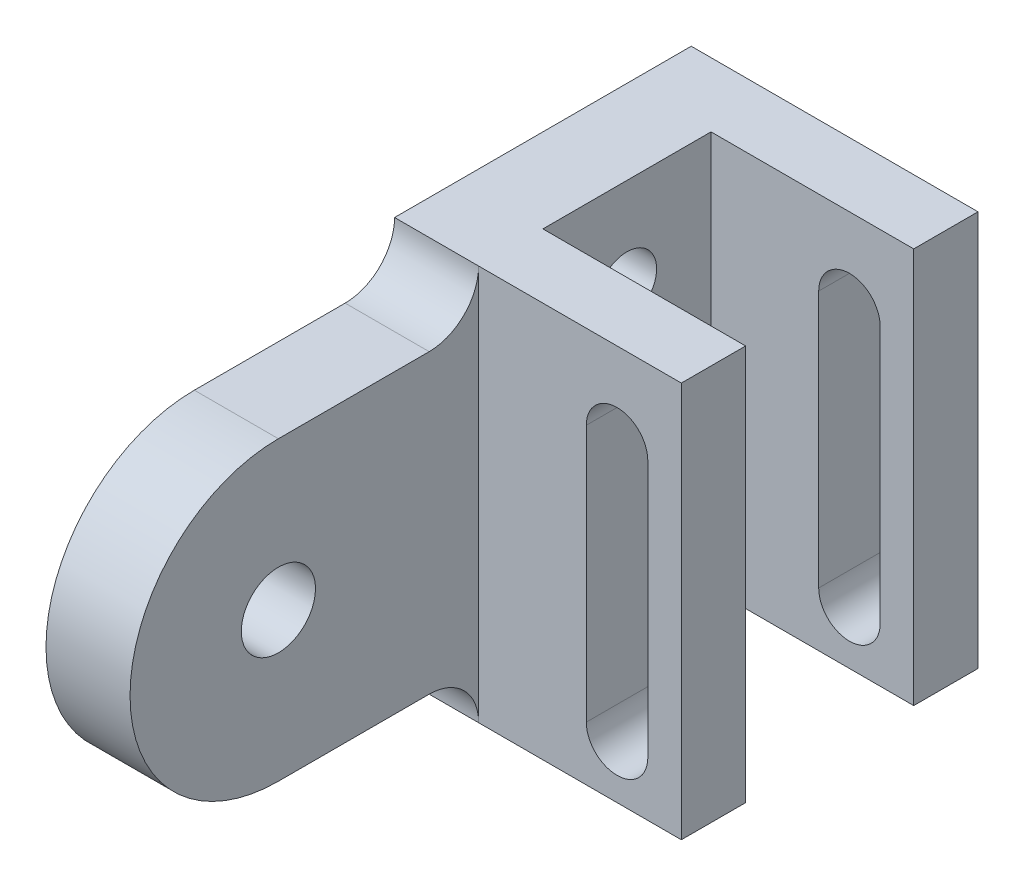
ISO-10303-21;
HEADER;
FILE_DESCRIPTION(('STEP AP214'),'2;1');
FILE_NAME('part.step','',(''),(''),'','','');
FILE_SCHEMA(('AUTOMOTIVE_DESIGN { 1 0 10303 214 1 1 1 1 }'));
ENDSEC;
DATA;
#1=APPLICATION_CONTEXT('core data for automotive mechanical design processes');
#2=APPLICATION_PROTOCOL_DEFINITION('international standard','automotive_design',2000,#1);
#3=PRODUCT_CONTEXT('',#1,'mechanical');
#4=PRODUCT('Part','Part','',(#3));
#5=PRODUCT_RELATED_PRODUCT_CATEGORY('part','',(#4));
#6=PRODUCT_DEFINITION_FORMATION('','',#4);
#7=PRODUCT_DEFINITION_CONTEXT('part definition',#1,'design');
#8=PRODUCT_DEFINITION('design','',#6,#7);
#9=PRODUCT_DEFINITION_SHAPE('','',#8);
#10=(LENGTH_UNIT() NAMED_UNIT(*) SI_UNIT(.MILLI.,.METRE.));
#11=(NAMED_UNIT(*) PLANE_ANGLE_UNIT() SI_UNIT($,.RADIAN.));
#12=(NAMED_UNIT(*) SI_UNIT($,.STERADIAN.) SOLID_ANGLE_UNIT());
#13=UNCERTAINTY_MEASURE_WITH_UNIT(LENGTH_MEASURE(1.E-05),#10,'distance_accuracy_value','');
#14=(GEOMETRIC_REPRESENTATION_CONTEXT(3) GLOBAL_UNCERTAINTY_ASSIGNED_CONTEXT((#13)) GLOBAL_UNIT_ASSIGNED_CONTEXT((#10,
#11,#12)) REPRESENTATION_CONTEXT('',''));
#15=CARTESIAN_POINT('',(0.,0.,0.));
#16=DIRECTION('',(0.,0.,1.));
#17=DIRECTION('',(1.,0.,0.));
#18=AXIS2_PLACEMENT_3D('',#15,#16,#17);
#19=CARTESIAN_POINT('',(0.,80.,0.));
#20=DIRECTION('',(0.,0.,-1.));
#21=DIRECTION('',(-1.,0.,0.));
#22=AXIS2_PLACEMENT_3D('',#19,#20,#21);
#23=PLANE('',#22);
#24=DIRECTION('',(0.,1.,0.));
#25=VECTOR('',#24,1.);
#26=CARTESIAN_POINT('',(51.2183501253269,11.,0.));
#27=LINE('',#26,#25);
#28=CARTESIAN_POINT('',(51.2183501253269,11.,0.));
#29=VERTEX_POINT('',#28);
#30=CARTESIAN_POINT('',(51.2183501253269,63.,0.));
#31=VERTEX_POINT('',#30);
#32=EDGE_CURVE('E228',#29,#31,#27,.T.);
#33=ORIENTED_EDGE('',*,*,#32,.F.);
#34=CARTESIAN_POINT('',(45.,11.,0.));
#35=DIRECTION('',(0.,0.,1.));
#36=DIRECTION('',(1.,0.,0.));
#37=AXIS2_PLACEMENT_3D('',#34,#35,#36);
#38=CIRCLE('',#37,6.21835012532688);
#39=CARTESIAN_POINT('',(38.7816498746731,11.,0.));
#40=VERTEX_POINT('',#39);
#41=EDGE_CURVE('E221',#40,#29,#38,.T.);
#42=ORIENTED_EDGE('',*,*,#41,.F.);
#43=DIRECTION('',(0.,-1.,0.));
#44=VECTOR('',#43,1.);
#45=CARTESIAN_POINT('',(38.7816498746731,11.,0.));
#46=LINE('',#45,#44);
#47=CARTESIAN_POINT('',(38.7816498746731,63.,0.));
#48=VERTEX_POINT('',#47);
#49=EDGE_CURVE('E234',#48,#40,#46,.T.);
#50=ORIENTED_EDGE('',*,*,#49,.F.);
#51=CARTESIAN_POINT('',(45.,63.,0.));
#52=DIRECTION('',(0.,0.,1.));
#53=DIRECTION('',(1.,0.,0.));
#54=AXIS2_PLACEMENT_3D('',#51,#52,#53);
#55=CIRCLE('',#54,6.21835012532688);
#56=EDGE_CURVE('E230',#31,#48,#55,.T.);
#57=ORIENTED_EDGE('',*,*,#56,.F.);
#58=EDGE_LOOP('',(#33,#42,#50,#57));
#59=FACE_BOUND('',#58,.T.);
#60=DIRECTION('',(0.,1.,0.));
#61=VECTOR('',#60,1.);
#62=CARTESIAN_POINT('',(17.,10.,0.));
#63=LINE('',#62,#61);
#64=CARTESIAN_POINT('',(17.,0.,0.));
#65=VERTEX_POINT('',#64);
#66=CARTESIAN_POINT('',(17.,80.,0.));
#67=VERTEX_POINT('',#66);
#68=EDGE_CURVE('E191',#65,#67,#63,.T.);
#69=ORIENTED_EDGE('',*,*,#68,.F.);
#70=DIRECTION('',(1.,0.,0.));
#71=VECTOR('',#70,1.);
#72=CARTESIAN_POINT('',(0.,0.,0.));
#73=LINE('',#72,#71);
#74=CARTESIAN_POINT('',(58.,0.,0.));
#75=VERTEX_POINT('',#74);
#76=EDGE_CURVE('E293',#65,#75,#73,.T.);
#77=ORIENTED_EDGE('',*,*,#76,.T.);
#78=DIRECTION('',(0.,-1.,0.));
#79=VECTOR('',#78,1.);
#80=CARTESIAN_POINT('',(58.,80.,0.));
#81=LINE('',#80,#79);
#82=CARTESIAN_POINT('',(58.,80.,0.));
#83=VERTEX_POINT('',#82);
#84=EDGE_CURVE('E330',#83,#75,#81,.T.);
#85=ORIENTED_EDGE('',*,*,#84,.F.);
#86=DIRECTION('',(1.,0.,0.));
#87=VECTOR('',#86,1.);
#88=CARTESIAN_POINT('',(0.,80.,0.));
#89=LINE('',#88,#87);
#90=EDGE_CURVE('E277',#67,#83,#89,.T.);
#91=ORIENTED_EDGE('',*,*,#90,.F.);
#92=EDGE_LOOP('',(#69,#77,#85,#91));
#93=FACE_BOUND('',#92,.T.);
#94=ADVANCED_FACE('F39',(#59,#93),#23,.F.);
#95=CARTESIAN_POINT('',(0.,80.,-60.));
#96=DIRECTION('',(1.,0.,0.));
#97=DIRECTION('',(0.,0.,-1.));
#98=AXIS2_PLACEMENT_3D('',#95,#96,#97);
#99=PLANE('',#98);
#100=CARTESIAN_POINT('',(0.,40.,40.5));
#101=DIRECTION('',(-1.,0.,0.));
#102=DIRECTION('',(0.,0.,1.));
#103=AXIS2_PLACEMENT_3D('',#100,#101,#102);
#104=CIRCLE('',#103,7.5);
#105=CARTESIAN_POINT('',(0.,40.,48.));
#106=VERTEX_POINT('',#105);
#107=EDGE_CURVE('E469',#106,#106,#104,.T.);
#108=ORIENTED_EDGE('',*,*,#107,.F.);
#109=EDGE_LOOP('',(#108));
#110=FACE_BOUND('',#109,.T.);
#111=CARTESIAN_POINT('',(0.,18.5,-30.));
#112=DIRECTION('',(1.,0.,0.));
#113=DIRECTION('',(0.,0.,-1.));
#114=AXIS2_PLACEMENT_3D('',#111,#112,#113);
#115=CIRCLE('',#114,5.99999999999999);
#116=CARTESIAN_POINT('',(0.,18.5,-36.));
#117=VERTEX_POINT('',#116);
#118=EDGE_CURVE('E222',#117,#117,#115,.T.);
#119=ORIENTED_EDGE('',*,*,#118,.T.);
#120=EDGE_LOOP('',(#119));
#121=FACE_BOUND('',#120,.T.);
#122=CARTESIAN_POINT('',(0.,61.5,-30.));
#123=DIRECTION('',(1.,0.,0.));
#124=DIRECTION('',(0.,0.,-1.));
#125=AXIS2_PLACEMENT_3D('',#122,#123,#124);
#126=CIRCLE('',#125,5.99999999999999);
#127=CARTESIAN_POINT('',(0.,61.5,-36.));
#128=VERTEX_POINT('',#127);
#129=EDGE_CURVE('E216',#128,#128,#126,.T.);
#130=ORIENTED_EDGE('',*,*,#129,.T.);
#131=EDGE_LOOP('',(#130));
#132=FACE_BOUND('',#131,.T.);
#133=DIRECTION('',(0.,0.,1.));
#134=VECTOR('',#133,1.);
#135=CARTESIAN_POINT('',(0.,0.,-60.));
#136=LINE('',#135,#134);
#137=CARTESIAN_POINT('',(0.,0.,-60.));
#138=VERTEX_POINT('',#137);
#139=CARTESIAN_POINT('',(0.,0.,0.));
#140=VERTEX_POINT('',#139);
#141=EDGE_CURVE('E275',#138,#140,#136,.T.);
#142=ORIENTED_EDGE('',*,*,#141,.T.);
#143=CARTESIAN_POINT('',(0.,0.,10.));
#144=DIRECTION('',(1.,0.,0.));
#145=DIRECTION('',(0.,0.,-1.));
#146=AXIS2_PLACEMENT_3D('',#143,#144,#145);
#147=CIRCLE('',#146,10.);
#148=CARTESIAN_POINT('',(0.,10.,10.));
#149=VERTEX_POINT('',#148);
#150=EDGE_CURVE('E50',#140,#149,#147,.T.);
#151=ORIENTED_EDGE('',*,*,#150,.T.);
#152=DIRECTION('',(0.,0.,-1.));
#153=VECTOR('',#152,1.);
#154=CARTESIAN_POINT('',(0.,10.,40.5));
#155=LINE('',#154,#153);
#156=CARTESIAN_POINT('',(0.,10.,40.5));
#157=VERTEX_POINT('',#156);
#158=EDGE_CURVE('E210',#157,#149,#155,.T.);
#159=ORIENTED_EDGE('',*,*,#158,.F.);
#160=CARTESIAN_POINT('',(0.,40.,40.5));
#161=DIRECTION('',(-1.,0.,0.));
#162=DIRECTION('',(0.,0.,1.));
#163=AXIS2_PLACEMENT_3D('',#160,#161,#162);
#164=CIRCLE('',#163,30.);
#165=CARTESIAN_POINT('',(0.,70.,40.5));
#166=VERTEX_POINT('',#165);
#167=EDGE_CURVE('E187',#157,#166,#164,.T.);
#168=ORIENTED_EDGE('',*,*,#167,.T.);
#169=DIRECTION('',(0.,0.,-1.));
#170=VECTOR('',#169,1.);
#171=CARTESIAN_POINT('',(0.,70.,40.5));
#172=LINE('',#171,#170);
#173=CARTESIAN_POINT('',(0.,70.,10.));
#174=VERTEX_POINT('',#173);
#175=EDGE_CURVE('E204',#166,#174,#172,.T.);
#176=ORIENTED_EDGE('',*,*,#175,.T.);
#177=CARTESIAN_POINT('',(0.,80.,10.));
#178=DIRECTION('',(1.,0.,0.));
#179=DIRECTION('',(0.,0.,-1.));
#180=AXIS2_PLACEMENT_3D('',#177,#178,#179);
#181=CIRCLE('',#180,10.);
#182=CARTESIAN_POINT('',(0.,80.,0.));
#183=VERTEX_POINT('',#182);
#184=EDGE_CURVE('E341',#174,#183,#181,.T.);
#185=ORIENTED_EDGE('',*,*,#184,.T.);
#186=DIRECTION('',(0.,0.,1.));
#187=VECTOR('',#186,1.);
#188=CARTESIAN_POINT('',(0.,80.,-60.));
#189=LINE('',#188,#187);
#190=CARTESIAN_POINT('',(0.,80.,-60.));
#191=VERTEX_POINT('',#190);
#192=EDGE_CURVE('E272',#191,#183,#189,.T.);
#193=ORIENTED_EDGE('',*,*,#192,.F.);
#194=DIRECTION('',(0.,-1.,0.));
#195=VECTOR('',#194,1.);
#196=CARTESIAN_POINT('',(0.,80.,-60.));
#197=LINE('',#196,#195);
#198=EDGE_CURVE('E291',#191,#138,#197,.T.);
#199=ORIENTED_EDGE('',*,*,#198,.T.);
#200=EDGE_LOOP('',(#142,#151,#159,#168,#176,#185,#193,#199));
#201=FACE_BOUND('',#200,.T.);
#202=ADVANCED_FACE('F356',(#110,#121,#132,#201),#99,.F.);
#203=CARTESIAN_POINT('',(58.,80.,0.));
#204=DIRECTION('',(-1.,0.,0.));
#205=DIRECTION('',(0.,0.,1.));
#206=AXIS2_PLACEMENT_3D('',#203,#204,#205);
#207=PLANE('',#206);
#208=DIRECTION('',(0.,0.,-1.));
#209=VECTOR('',#208,1.);
#210=CARTESIAN_POINT('',(58.,0.,0.));
#211=LINE('',#210,#209);
#212=CARTESIAN_POINT('',(58.,0.,-13.));
#213=VERTEX_POINT('',#212);
#214=EDGE_CURVE('E300',#75,#213,#211,.T.);
#215=ORIENTED_EDGE('',*,*,#214,.T.);
#216=DIRECTION('',(0.,-1.,0.));
#217=VECTOR('',#216,1.);
#218=CARTESIAN_POINT('',(58.,80.,-13.));
#219=LINE('',#218,#217);
#220=CARTESIAN_POINT('',(58.,80.,-13.));
#221=VERTEX_POINT('',#220);
#222=EDGE_CURVE('E322',#221,#213,#219,.T.);
#223=ORIENTED_EDGE('',*,*,#222,.F.);
#224=DIRECTION('',(0.,0.,-1.));
#225=VECTOR('',#224,1.);
#226=CARTESIAN_POINT('',(58.,80.,0.));
#227=LINE('',#226,#225);
#228=EDGE_CURVE('E283',#83,#221,#227,.T.);
#229=ORIENTED_EDGE('',*,*,#228,.F.);
#230=ORIENTED_EDGE('',*,*,#84,.T.);
#231=EDGE_LOOP('',(#215,#223,#229,#230));
#232=FACE_BOUND('',#231,.T.);
#233=ADVANCED_FACE('F388',(#232),#207,.F.);
#234=CARTESIAN_POINT('',(58.,80.,-13.));
#235=DIRECTION('',(0.,0.,1.));
#236=DIRECTION('',(1.,0.,0.));
#237=AXIS2_PLACEMENT_3D('',#234,#235,#236);
#238=PLANE('',#237);
#239=DIRECTION('',(0.,-1.,0.));
#240=VECTOR('',#239,1.);
#241=CARTESIAN_POINT('',(38.7816498746731,80.,-13.));
#242=LINE('',#241,#240);
#243=CARTESIAN_POINT('',(38.7816498746731,63.,-13.));
#244=VERTEX_POINT('',#243);
#245=CARTESIAN_POINT('',(38.7816498746731,11.,-13.));
#246=VERTEX_POINT('',#245);
#247=EDGE_CURVE('E263',#244,#246,#242,.T.);
#248=ORIENTED_EDGE('',*,*,#247,.T.);
#249=CARTESIAN_POINT('',(45.,11.,-13.));
#250=DIRECTION('',(0.,0.,1.));
#251=DIRECTION('',(1.,0.,0.));
#252=AXIS2_PLACEMENT_3D('',#249,#250,#251);
#253=CIRCLE('',#252,6.21835012532688);
#254=CARTESIAN_POINT('',(51.2183501253269,11.,-13.));
#255=VERTEX_POINT('',#254);
#256=EDGE_CURVE('E267',#246,#255,#253,.T.);
#257=ORIENTED_EDGE('',*,*,#256,.T.);
#258=DIRECTION('',(0.,1.,0.));
#259=VECTOR('',#258,1.);
#260=CARTESIAN_POINT('',(51.2183501253269,80.,-13.));
#261=LINE('',#260,#259);
#262=CARTESIAN_POINT('',(51.2183501253269,63.,-13.));
#263=VERTEX_POINT('',#262);
#264=EDGE_CURVE('E253',#255,#263,#261,.T.);
#265=ORIENTED_EDGE('',*,*,#264,.T.);
#266=CARTESIAN_POINT('',(45.,63.,-13.));
#267=DIRECTION('',(0.,0.,1.));
#268=DIRECTION('',(1.,0.,0.));
#269=AXIS2_PLACEMENT_3D('',#266,#267,#268);
#270=CIRCLE('',#269,6.21835012532688);
#271=EDGE_CURVE('E260',#263,#244,#270,.T.);
#272=ORIENTED_EDGE('',*,*,#271,.T.);
#273=EDGE_LOOP('',(#248,#257,#265,#272));
#274=FACE_BOUND('',#273,.T.);
#275=DIRECTION('',(-1.,0.,0.));
#276=VECTOR('',#275,1.);
#277=CARTESIAN_POINT('',(58.,0.,-13.));
#278=LINE('',#277,#276);
#279=CARTESIAN_POINT('',(17.,0.,-13.));
#280=VERTEX_POINT('',#279);
#281=EDGE_CURVE('E303',#213,#280,#278,.T.);
#282=ORIENTED_EDGE('',*,*,#281,.T.);
#283=DIRECTION('',(0.,-1.,0.));
#284=VECTOR('',#283,1.);
#285=CARTESIAN_POINT('',(17.,80.,-13.));
#286=LINE('',#285,#284);
#287=CARTESIAN_POINT('',(17.,80.,-13.));
#288=VERTEX_POINT('',#287);
#289=EDGE_CURVE('E321',#288,#280,#286,.T.);
#290=ORIENTED_EDGE('',*,*,#289,.F.);
#291=DIRECTION('',(-1.,0.,0.));
#292=VECTOR('',#291,1.);
#293=CARTESIAN_POINT('',(58.,80.,-13.));
#294=LINE('',#293,#292);
#295=EDGE_CURVE('E282',#221,#288,#294,.T.);
#296=ORIENTED_EDGE('',*,*,#295,.F.);
#297=ORIENTED_EDGE('',*,*,#222,.T.);
#298=EDGE_LOOP('',(#282,#290,#296,#297));
#299=FACE_BOUND('',#298,.T.);
#300=ADVANCED_FACE('F397',(#274,#299),#238,.F.);
#301=CARTESIAN_POINT('',(17.,80.,-13.));
#302=DIRECTION('',(-1.,0.,0.));
#303=DIRECTION('',(0.,0.,1.));
#304=AXIS2_PLACEMENT_3D('',#301,#302,#303);
#305=PLANE('',#304);
#306=CARTESIAN_POINT('',(17.,18.5,-30.));
#307=DIRECTION('',(1.,0.,0.));
#308=DIRECTION('',(0.,0.,-1.));
#309=AXIS2_PLACEMENT_3D('',#306,#307,#308);
#310=CIRCLE('',#309,5.99999999999999);
#311=CARTESIAN_POINT('',(17.,18.5,-36.));
#312=VERTEX_POINT('',#311);
#313=EDGE_CURVE('E213',#312,#312,#310,.T.);
#314=ORIENTED_EDGE('',*,*,#313,.F.);
#315=EDGE_LOOP('',(#314));
#316=FACE_BOUND('',#315,.T.);
#317=CARTESIAN_POINT('',(17.,61.5,-30.));
#318=DIRECTION('',(1.,0.,0.));
#319=DIRECTION('',(0.,0.,-1.));
#320=AXIS2_PLACEMENT_3D('',#317,#318,#319);
#321=CIRCLE('',#320,5.99999999999999);
#322=CARTESIAN_POINT('',(17.,61.5,-36.));
#323=VERTEX_POINT('',#322);
#324=EDGE_CURVE('E211',#323,#323,#321,.T.);
#325=ORIENTED_EDGE('',*,*,#324,.F.);
#326=EDGE_LOOP('',(#325));
#327=FACE_BOUND('',#326,.T.);
#328=DIRECTION('',(0.,0.,-1.));
#329=VECTOR('',#328,1.);
#330=CARTESIAN_POINT('',(17.,0.,-13.));
#331=LINE('',#330,#329);
#332=CARTESIAN_POINT('',(17.,0.,-47.));
#333=VERTEX_POINT('',#332);
#334=EDGE_CURVE('E302',#280,#333,#331,.T.);
#335=ORIENTED_EDGE('',*,*,#334,.T.);
#336=DIRECTION('',(0.,-1.,0.));
#337=VECTOR('',#336,1.);
#338=CARTESIAN_POINT('',(17.,80.,-47.));
#339=LINE('',#338,#337);
#340=CARTESIAN_POINT('',(17.,80.,-47.));
#341=VERTEX_POINT('',#340);
#342=EDGE_CURVE('E318',#341,#333,#339,.T.);
#343=ORIENTED_EDGE('',*,*,#342,.F.);
#344=DIRECTION('',(0.,0.,-1.));
#345=VECTOR('',#344,1.);
#346=CARTESIAN_POINT('',(17.,80.,-13.));
#347=LINE('',#346,#345);
#348=EDGE_CURVE('E281',#288,#341,#347,.T.);
#349=ORIENTED_EDGE('',*,*,#348,.F.);
#350=ORIENTED_EDGE('',*,*,#289,.T.);
#351=EDGE_LOOP('',(#335,#343,#349,#350));
#352=FACE_BOUND('',#351,.T.);
#353=ADVANCED_FACE('F405',(#316,#327,#352),#305,.F.);
#354=CARTESIAN_POINT('',(17.,80.,-47.));
#355=DIRECTION('',(0.,0.,-1.));
#356=DIRECTION('',(-1.,0.,0.));
#357=AXIS2_PLACEMENT_3D('',#354,#355,#356);
#358=PLANE('',#357);
#359=DIRECTION('',(0.,-1.,0.));
#360=VECTOR('',#359,1.);
#361=CARTESIAN_POINT('',(51.2183501253269,80.,-47.));
#362=LINE('',#361,#360);
#363=CARTESIAN_POINT('',(51.2183501253269,63.,-47.));
#364=VERTEX_POINT('',#363);
#365=CARTESIAN_POINT('',(51.2183501253269,11.,-47.));
#366=VERTEX_POINT('',#365);
#367=EDGE_CURVE('E247',#364,#366,#362,.T.);
#368=ORIENTED_EDGE('',*,*,#367,.T.);
#369=CARTESIAN_POINT('',(45.,11.,-47.));
#370=DIRECTION('',(0.,0.,-1.));
#371=DIRECTION('',(-1.,0.,0.));
#372=AXIS2_PLACEMENT_3D('',#369,#370,#371);
#373=CIRCLE('',#372,6.21835012532688);
#374=CARTESIAN_POINT('',(38.7816498746731,11.,-47.));
#375=VERTEX_POINT('',#374);
#376=EDGE_CURVE('E266',#366,#375,#373,.T.);
#377=ORIENTED_EDGE('',*,*,#376,.T.);
#378=DIRECTION('',(0.,1.,0.));
#379=VECTOR('',#378,1.);
#380=CARTESIAN_POINT('',(38.7816498746731,80.,-47.));
#381=LINE('',#380,#379);
#382=CARTESIAN_POINT('',(38.7816498746731,63.,-47.));
#383=VERTEX_POINT('',#382);
#384=EDGE_CURVE('E257',#375,#383,#381,.T.);
#385=ORIENTED_EDGE('',*,*,#384,.T.);
#386=CARTESIAN_POINT('',(45.,63.,-47.));
#387=DIRECTION('',(0.,0.,-1.));
#388=DIRECTION('',(-1.,0.,0.));
#389=AXIS2_PLACEMENT_3D('',#386,#387,#388);
#390=CIRCLE('',#389,6.21835012532688);
#391=EDGE_CURVE('E255',#383,#364,#390,.T.);
#392=ORIENTED_EDGE('',*,*,#391,.T.);
#393=EDGE_LOOP('',(#368,#377,#385,#392));
#394=FACE_BOUND('',#393,.T.);
#395=DIRECTION('',(1.,0.,0.));
#396=VECTOR('',#395,1.);
#397=CARTESIAN_POINT('',(17.,0.,-47.));
#398=LINE('',#397,#396);
#399=CARTESIAN_POINT('',(58.,0.,-47.));
#400=VERTEX_POINT('',#399);
#401=EDGE_CURVE('E301',#333,#400,#398,.T.);
#402=ORIENTED_EDGE('',*,*,#401,.T.);
#403=DIRECTION('',(0.,-1.,0.));
#404=VECTOR('',#403,1.);
#405=CARTESIAN_POINT('',(58.,80.,-47.));
#406=LINE('',#405,#404);
#407=CARTESIAN_POINT('',(58.,80.,-47.));
#408=VERTEX_POINT('',#407);
#409=EDGE_CURVE('E312',#408,#400,#406,.T.);
#410=ORIENTED_EDGE('',*,*,#409,.F.);
#411=DIRECTION('',(1.,0.,0.));
#412=VECTOR('',#411,1.);
#413=CARTESIAN_POINT('',(17.,80.,-47.));
#414=LINE('',#413,#412);
#415=EDGE_CURVE('E289',#341,#408,#414,.T.);
#416=ORIENTED_EDGE('',*,*,#415,.F.);
#417=ORIENTED_EDGE('',*,*,#342,.T.);
#418=EDGE_LOOP('',(#402,#410,#416,#417));
#419=FACE_BOUND('',#418,.T.);
#420=ADVANCED_FACE('F408',(#394,#419),#358,.F.);
#421=CARTESIAN_POINT('',(58.,80.,-47.));
#422=DIRECTION('',(-1.,0.,0.));
#423=DIRECTION('',(0.,0.,1.));
#424=AXIS2_PLACEMENT_3D('',#421,#422,#423);
#425=PLANE('',#424);
#426=DIRECTION('',(0.,0.,-1.));
#427=VECTOR('',#426,1.);
#428=CARTESIAN_POINT('',(58.,0.,-47.));
#429=LINE('',#428,#427);
#430=CARTESIAN_POINT('',(58.,0.,-60.));
#431=VERTEX_POINT('',#430);
#432=EDGE_CURVE('E307',#400,#431,#429,.T.);
#433=ORIENTED_EDGE('',*,*,#432,.T.);
#434=DIRECTION('',(0.,-1.,0.));
#435=VECTOR('',#434,1.);
#436=CARTESIAN_POINT('',(58.,80.,-60.));
#437=LINE('',#436,#435);
#438=CARTESIAN_POINT('',(58.,80.,-60.));
#439=VERTEX_POINT('',#438);
#440=EDGE_CURVE('E315',#439,#431,#437,.T.);
#441=ORIENTED_EDGE('',*,*,#440,.F.);
#442=DIRECTION('',(0.,0.,-1.));
#443=VECTOR('',#442,1.);
#444=CARTESIAN_POINT('',(58.,80.,-47.));
#445=LINE('',#444,#443);
#446=EDGE_CURVE('E290',#408,#439,#445,.T.);
#447=ORIENTED_EDGE('',*,*,#446,.F.);
#448=ORIENTED_EDGE('',*,*,#409,.T.);
#449=EDGE_LOOP('',(#433,#441,#447,#448));
#450=FACE_BOUND('',#449,.T.);
#451=ADVANCED_FACE('F406',(#450),#425,.F.);
#452=CARTESIAN_POINT('',(58.,80.,-60.));
#453=DIRECTION('',(0.,0.,1.));
#454=DIRECTION('',(1.,0.,0.));
#455=AXIS2_PLACEMENT_3D('',#452,#453,#454);
#456=PLANE('',#455);
#457=DIRECTION('',(0.,-1.,0.));
#458=VECTOR('',#457,1.);
#459=CARTESIAN_POINT('',(38.7816498746731,80.,-60.));
#460=LINE('',#459,#458);
#461=CARTESIAN_POINT('',(38.7816498746731,63.,-60.));
#462=VERTEX_POINT('',#461);
#463=CARTESIAN_POINT('',(38.7816498746731,11.,-60.));
#464=VERTEX_POINT('',#463);
#465=EDGE_CURVE('E338',#462,#464,#460,.T.);
#466=ORIENTED_EDGE('',*,*,#465,.T.);
#467=CARTESIAN_POINT('',(45.,11.,-60.));
#468=DIRECTION('',(0.,0.,1.));
#469=DIRECTION('',(1.,0.,0.));
#470=AXIS2_PLACEMENT_3D('',#467,#468,#469);
#471=CIRCLE('',#470,6.21835012532688);
#472=CARTESIAN_POINT('',(51.2183501253269,11.,-60.));
#473=VERTEX_POINT('',#472);
#474=EDGE_CURVE('E340',#464,#473,#471,.T.);
#475=ORIENTED_EDGE('',*,*,#474,.T.);
#476=DIRECTION('',(0.,1.,0.));
#477=VECTOR('',#476,1.);
#478=CARTESIAN_POINT('',(51.2183501253269,80.,-60.));
#479=LINE('',#478,#477);
#480=CARTESIAN_POINT('',(51.2183501253269,63.,-60.));
#481=VERTEX_POINT('',#480);
#482=EDGE_CURVE('E329',#473,#481,#479,.T.);
#483=ORIENTED_EDGE('',*,*,#482,.T.);
#484=CARTESIAN_POINT('',(45.,63.,-60.));
#485=DIRECTION('',(0.,0.,1.));
#486=DIRECTION('',(1.,0.,0.));
#487=AXIS2_PLACEMENT_3D('',#484,#485,#486);
#488=CIRCLE('',#487,6.21835012532688);
#489=EDGE_CURVE('E334',#481,#462,#488,.T.);
#490=ORIENTED_EDGE('',*,*,#489,.T.);
#491=EDGE_LOOP('',(#466,#475,#483,#490));
#492=FACE_BOUND('',#491,.T.);
#493=DIRECTION('',(-1.,0.,0.));
#494=VECTOR('',#493,1.);
#495=CARTESIAN_POINT('',(58.,0.,-60.));
#496=LINE('',#495,#494);
#497=EDGE_CURVE('E280',#431,#138,#496,.T.);
#498=ORIENTED_EDGE('',*,*,#497,.T.);
#499=ORIENTED_EDGE('',*,*,#198,.F.);
#500=DIRECTION('',(-1.,0.,0.));
#501=VECTOR('',#500,1.);
#502=CARTESIAN_POINT('',(58.,80.,-60.));
#503=LINE('',#502,#501);
#504=EDGE_CURVE('E292',#439,#191,#503,.T.);
#505=ORIENTED_EDGE('',*,*,#504,.F.);
#506=ORIENTED_EDGE('',*,*,#440,.T.);
#507=EDGE_LOOP('',(#498,#499,#505,#506));
#508=FACE_BOUND('',#507,.T.);
#509=ADVANCED_FACE('F366',(#492,#508),#456,.F.);
#510=CARTESIAN_POINT('',(0.,80.,0.));
#511=DIRECTION('',(0.,1.,0.));
#512=DIRECTION('',(0.,0.,1.));
#513=AXIS2_PLACEMENT_3D('',#510,#511,#512);
#514=PLANE('',#513);
#515=ORIENTED_EDGE('',*,*,#192,.T.);
#516=EDGE_CURVE('E279',#183,#67,#89,.T.);
#517=ORIENTED_EDGE('',*,*,#516,.T.);
#518=ORIENTED_EDGE('',*,*,#90,.T.);
#519=ORIENTED_EDGE('',*,*,#228,.T.);
#520=ORIENTED_EDGE('',*,*,#295,.T.);
#521=ORIENTED_EDGE('',*,*,#348,.T.);
#522=ORIENTED_EDGE('',*,*,#415,.T.);
#523=ORIENTED_EDGE('',*,*,#446,.T.);
#524=ORIENTED_EDGE('',*,*,#504,.T.);
#525=EDGE_LOOP('',(#515,#517,#518,#519,#520,#521,#522,#523,#524));
#526=FACE_BOUND('',#525,.T.);
#527=ADVANCED_FACE('F362',(#526),#514,.T.);
#528=CARTESIAN_POINT('',(0.,0.,0.));
#529=DIRECTION('',(0.,1.,0.));
#530=DIRECTION('',(0.,0.,1.));
#531=AXIS2_PLACEMENT_3D('',#528,#529,#530);
#532=PLANE('',#531);
#533=ORIENTED_EDGE('',*,*,#141,.F.);
#534=ORIENTED_EDGE('',*,*,#497,.F.);
#535=ORIENTED_EDGE('',*,*,#432,.F.);
#536=ORIENTED_EDGE('',*,*,#401,.F.);
#537=ORIENTED_EDGE('',*,*,#334,.F.);
#538=ORIENTED_EDGE('',*,*,#281,.F.);
#539=ORIENTED_EDGE('',*,*,#214,.F.);
#540=ORIENTED_EDGE('',*,*,#76,.F.);
#541=EDGE_CURVE('E298',#140,#65,#73,.T.);
#542=ORIENTED_EDGE('',*,*,#541,.F.);
#543=EDGE_LOOP('',(#533,#534,#535,#536,#537,#538,#539,#540,#542));
#544=FACE_BOUND('',#543,.T.);
#545=ADVANCED_FACE('F373',(#544),#532,.F.);
#546=CARTESIAN_POINT('',(51.2183501253269,11.,-80.));
#547=DIRECTION('',(1.,0.,0.));
#548=DIRECTION('',(0.,0.,-1.));
#549=AXIS2_PLACEMENT_3D('',#546,#547,#548);
#550=PLANE('',#549);
#551=DIRECTION('',(0.,0.,1.));
#552=VECTOR('',#551,1.);
#553=CARTESIAN_POINT('',(51.2183501253269,63.,-80.));
#554=LINE('',#553,#552);
#555=EDGE_CURVE('E244',#481,#364,#554,.T.);
#556=ORIENTED_EDGE('',*,*,#555,.F.);
#557=ORIENTED_EDGE('',*,*,#482,.F.);
#558=DIRECTION('',(0.,0.,1.));
#559=VECTOR('',#558,1.);
#560=CARTESIAN_POINT('',(51.2183501253269,11.,-80.));
#561=LINE('',#560,#559);
#562=EDGE_CURVE('E241',#473,#366,#561,.T.);
#563=ORIENTED_EDGE('',*,*,#562,.T.);
#564=ORIENTED_EDGE('',*,*,#367,.F.);
#565=EDGE_LOOP('',(#556,#557,#563,#564));
#566=FACE_BOUND('',#565,.T.);
#567=ADVANCED_FACE('F419',(#566),#550,.F.);
#568=CARTESIAN_POINT('',(45.,63.,-80.));
#569=DIRECTION('',(0.,0.,1.));
#570=DIRECTION('',(1.,0.,0.));
#571=AXIS2_PLACEMENT_3D('',#568,#569,#570);
#572=CYLINDRICAL_SURFACE('',#571,6.21835012532688);
#573=DIRECTION('',(0.,0.,1.));
#574=VECTOR('',#573,1.);
#575=CARTESIAN_POINT('',(38.7816498746731,63.,-80.));
#576=LINE('',#575,#574);
#577=EDGE_CURVE('E239',#462,#383,#576,.T.);
#578=ORIENTED_EDGE('',*,*,#577,.F.);
#579=ORIENTED_EDGE('',*,*,#489,.F.);
#580=ORIENTED_EDGE('',*,*,#555,.T.);
#581=ORIENTED_EDGE('',*,*,#391,.F.);
#582=EDGE_LOOP('',(#578,#579,#580,#581));
#583=FACE_BOUND('',#582,.T.);
#584=ADVANCED_FACE('F437',(#583),#572,.F.);
#585=CARTESIAN_POINT('',(38.7816498746731,11.,-80.));
#586=DIRECTION('',(-1.,0.,0.));
#587=DIRECTION('',(0.,0.,1.));
#588=AXIS2_PLACEMENT_3D('',#585,#586,#587);
#589=PLANE('',#588);
#590=DIRECTION('',(0.,0.,1.));
#591=VECTOR('',#590,1.);
#592=CARTESIAN_POINT('',(38.7816498746731,11.,-80.));
#593=LINE('',#592,#591);
#594=EDGE_CURVE('E236',#464,#375,#593,.T.);
#595=ORIENTED_EDGE('',*,*,#594,.F.);
#596=ORIENTED_EDGE('',*,*,#465,.F.);
#597=ORIENTED_EDGE('',*,*,#577,.T.);
#598=ORIENTED_EDGE('',*,*,#384,.F.);
#599=EDGE_LOOP('',(#595,#596,#597,#598));
#600=FACE_BOUND('',#599,.T.);
#601=ADVANCED_FACE('F445',(#600),#589,.F.);
#602=CARTESIAN_POINT('',(45.,11.,-80.));
#603=DIRECTION('',(0.,0.,1.));
#604=DIRECTION('',(1.,0.,0.));
#605=AXIS2_PLACEMENT_3D('',#602,#603,#604);
#606=CYLINDRICAL_SURFACE('',#605,6.21835012532688);
#607=ORIENTED_EDGE('',*,*,#562,.F.);
#608=ORIENTED_EDGE('',*,*,#474,.F.);
#609=ORIENTED_EDGE('',*,*,#594,.T.);
#610=ORIENTED_EDGE('',*,*,#376,.F.);
#611=EDGE_LOOP('',(#607,#608,#609,#610));
#612=FACE_BOUND('',#611,.T.);
#613=ADVANCED_FACE('F430',(#612),#606,.F.);
#614=EDGE_CURVE('E237',#246,#40,#593,.T.);
#615=ORIENTED_EDGE('',*,*,#614,.T.);
#616=ORIENTED_EDGE('',*,*,#41,.T.);
#617=EDGE_CURVE('E231',#255,#29,#561,.T.);
#618=ORIENTED_EDGE('',*,*,#617,.F.);
#619=ORIENTED_EDGE('',*,*,#256,.F.);
#620=EDGE_LOOP('',(#615,#616,#618,#619));
#621=FACE_BOUND('',#620,.T.);
#622=ADVANCED_FACE('F421',(#621),#606,.F.);
#623=EDGE_CURVE('E238',#244,#48,#576,.T.);
#624=ORIENTED_EDGE('',*,*,#623,.T.);
#625=ORIENTED_EDGE('',*,*,#49,.T.);
#626=ORIENTED_EDGE('',*,*,#614,.F.);
#627=ORIENTED_EDGE('',*,*,#247,.F.);
#628=EDGE_LOOP('',(#624,#625,#626,#627));
#629=FACE_BOUND('',#628,.T.);
#630=ADVANCED_FACE('F426',(#629),#589,.F.);
#631=EDGE_CURVE('E242',#263,#31,#554,.T.);
#632=ORIENTED_EDGE('',*,*,#631,.T.);
#633=ORIENTED_EDGE('',*,*,#56,.T.);
#634=ORIENTED_EDGE('',*,*,#623,.F.);
#635=ORIENTED_EDGE('',*,*,#271,.F.);
#636=EDGE_LOOP('',(#632,#633,#634,#635));
#637=FACE_BOUND('',#636,.T.);
#638=ADVANCED_FACE('F433',(#637),#572,.F.);
#639=ORIENTED_EDGE('',*,*,#617,.T.);
#640=ORIENTED_EDGE('',*,*,#32,.T.);
#641=ORIENTED_EDGE('',*,*,#631,.F.);
#642=ORIENTED_EDGE('',*,*,#264,.F.);
#643=EDGE_LOOP('',(#639,#640,#641,#642));
#644=FACE_BOUND('',#643,.T.);
#645=ADVANCED_FACE('F427',(#644),#550,.F.);
#646=CARTESIAN_POINT('',(-63.,61.5,-30.));
#647=DIRECTION('',(1.,0.,0.));
#648=DIRECTION('',(0.,0.,-1.));
#649=AXIS2_PLACEMENT_3D('',#646,#647,#648);
#650=CYLINDRICAL_SURFACE('',#649,5.99999999999999);
#651=ORIENTED_EDGE('',*,*,#324,.T.);
#652=EDGE_LOOP('',(#651));
#653=FACE_BOUND('',#652,.T.);
#654=ORIENTED_EDGE('',*,*,#129,.F.);
#655=EDGE_LOOP('',(#654));
#656=FACE_BOUND('',#655,.T.);
#657=ADVANCED_FACE('F435',(#653,#656),#650,.F.);
#658=CARTESIAN_POINT('',(-63.,18.5,-30.));
#659=DIRECTION('',(1.,0.,0.));
#660=DIRECTION('',(0.,0.,-1.));
#661=AXIS2_PLACEMENT_3D('',#658,#659,#660);
#662=CYLINDRICAL_SURFACE('',#661,5.99999999999999);
#663=ORIENTED_EDGE('',*,*,#313,.T.);
#664=EDGE_LOOP('',(#663));
#665=FACE_BOUND('',#664,.T.);
#666=ORIENTED_EDGE('',*,*,#118,.F.);
#667=EDGE_LOOP('',(#666));
#668=FACE_BOUND('',#667,.T.);
#669=ADVANCED_FACE('F443',(#665,#668),#662,.F.);
#670=CARTESIAN_POINT('',(17.,70.,40.5));
#671=DIRECTION('',(0.,1.,0.));
#672=DIRECTION('',(0.,0.,1.));
#673=AXIS2_PLACEMENT_3D('',#670,#671,#672);
#674=PLANE('',#673);
#675=DIRECTION('',(0.,0.,-1.));
#676=VECTOR('',#675,1.);
#677=CARTESIAN_POINT('',(17.,70.,40.5));
#678=LINE('',#677,#676);
#679=CARTESIAN_POINT('',(17.,70.,40.5));
#680=VERTEX_POINT('',#679);
#681=CARTESIAN_POINT('',(17.,70.,10.));
#682=VERTEX_POINT('',#681);
#683=EDGE_CURVE('E199',#680,#682,#678,.T.);
#684=ORIENTED_EDGE('',*,*,#683,.T.);
#685=DIRECTION('',(-1.,0.,0.));
#686=VECTOR('',#685,1.);
#687=CARTESIAN_POINT('',(17.,70.,10.));
#688=LINE('',#687,#686);
#689=EDGE_CURVE('E344',#682,#174,#688,.T.);
#690=ORIENTED_EDGE('',*,*,#689,.T.);
#691=ORIENTED_EDGE('',*,*,#175,.F.);
#692=DIRECTION('',(-1.,0.,0.));
#693=VECTOR('',#692,1.);
#694=CARTESIAN_POINT('',(17.,70.,40.5));
#695=LINE('',#694,#693);
#696=EDGE_CURVE('E190',#680,#166,#695,.T.);
#697=ORIENTED_EDGE('',*,*,#696,.F.);
#698=EDGE_LOOP('',(#684,#690,#691,#697));
#699=FACE_BOUND('',#698,.T.);
#700=ADVANCED_FACE('F351',(#699),#674,.T.);
#701=CARTESIAN_POINT('',(17.,40.,40.5));
#702=DIRECTION('',(-1.,0.,0.));
#703=DIRECTION('',(0.,0.,1.));
#704=AXIS2_PLACEMENT_3D('',#701,#702,#703);
#705=CYLINDRICAL_SURFACE('',#704,30.);
#706=ORIENTED_EDGE('',*,*,#167,.F.);
#707=DIRECTION('',(-1.,0.,0.));
#708=VECTOR('',#707,1.);
#709=CARTESIAN_POINT('',(17.,10.,40.5));
#710=LINE('',#709,#708);
#711=CARTESIAN_POINT('',(17.,10.,40.5));
#712=VERTEX_POINT('',#711);
#713=EDGE_CURVE('E181',#712,#157,#710,.T.);
#714=ORIENTED_EDGE('',*,*,#713,.F.);
#715=CARTESIAN_POINT('',(17.,40.,40.5));
#716=DIRECTION('',(-1.,0.,0.));
#717=DIRECTION('',(0.,0.,1.));
#718=AXIS2_PLACEMENT_3D('',#715,#716,#717);
#719=CIRCLE('',#718,30.);
#720=EDGE_CURVE('E188',#712,#680,#719,.T.);
#721=ORIENTED_EDGE('',*,*,#720,.T.);
#722=ORIENTED_EDGE('',*,*,#696,.T.);
#723=EDGE_LOOP('',(#706,#714,#721,#722));
#724=FACE_BOUND('',#723,.T.);
#725=ADVANCED_FACE('F184',(#724),#705,.T.);
#726=CARTESIAN_POINT('',(17.,10.,40.5));
#727=DIRECTION('',(0.,1.,0.));
#728=DIRECTION('',(0.,0.,1.));
#729=AXIS2_PLACEMENT_3D('',#726,#727,#728);
#730=PLANE('',#729);
#731=ORIENTED_EDGE('',*,*,#158,.T.);
#732=DIRECTION('',(-1.,0.,0.));
#733=VECTOR('',#732,1.);
#734=CARTESIAN_POINT('',(17.,10.,10.));
#735=LINE('',#734,#733);
#736=CARTESIAN_POINT('',(17.,10.,10.));
#737=VERTEX_POINT('',#736);
#738=EDGE_CURVE('E53',#149,#737,#735,.F.);
#739=ORIENTED_EDGE('',*,*,#738,.T.);
#740=DIRECTION('',(0.,0.,-1.));
#741=VECTOR('',#740,1.);
#742=CARTESIAN_POINT('',(17.,10.,40.5));
#743=LINE('',#742,#741);
#744=EDGE_CURVE('E193',#712,#737,#743,.T.);
#745=ORIENTED_EDGE('',*,*,#744,.F.);
#746=ORIENTED_EDGE('',*,*,#713,.T.);
#747=EDGE_LOOP('',(#731,#739,#745,#746));
#748=FACE_BOUND('',#747,.T.);
#749=ADVANCED_FACE('F194',(#748),#730,.F.);
#750=CARTESIAN_POINT('',(17.,40.,40.5));
#751=DIRECTION('',(-1.,0.,0.));
#752=DIRECTION('',(0.,0.,1.));
#753=AXIS2_PLACEMENT_3D('',#750,#751,#752);
#754=PLANE('',#753);
#755=CARTESIAN_POINT('',(17.,40.,40.5));
#756=DIRECTION('',(-1.,0.,0.));
#757=DIRECTION('',(0.,0.,1.));
#758=AXIS2_PLACEMENT_3D('',#755,#756,#757);
#759=CIRCLE('',#758,7.5);
#760=CARTESIAN_POINT('',(17.,40.,48.));
#761=VERTEX_POINT('',#760);
#762=EDGE_CURVE('E208',#761,#761,#759,.T.);
#763=ORIENTED_EDGE('',*,*,#762,.T.);
#764=EDGE_LOOP('',(#763));
#765=FACE_BOUND('',#764,.T.);
#766=ORIENTED_EDGE('',*,*,#683,.F.);
#767=ORIENTED_EDGE('',*,*,#720,.F.);
#768=ORIENTED_EDGE('',*,*,#744,.T.);
#769=CARTESIAN_POINT('',(17.,0.,10.));
#770=DIRECTION('',(-1.,0.,0.));
#771=DIRECTION('',(0.,0.,1.));
#772=AXIS2_PLACEMENT_3D('',#769,#770,#771);
#773=CIRCLE('',#772,10.);
#774=EDGE_CURVE('E11',#737,#65,#773,.T.);
#775=ORIENTED_EDGE('',*,*,#774,.T.);
#776=ORIENTED_EDGE('',*,*,#68,.T.);
#777=CARTESIAN_POINT('',(17.,80.,10.));
#778=DIRECTION('',(-1.,0.,0.));
#779=DIRECTION('',(0.,0.,1.));
#780=AXIS2_PLACEMENT_3D('',#777,#778,#779);
#781=CIRCLE('',#780,10.);
#782=EDGE_CURVE('E350',#67,#682,#781,.T.);
#783=ORIENTED_EDGE('',*,*,#782,.T.);
#784=EDGE_LOOP('',(#766,#767,#768,#775,#776,#783));
#785=FACE_BOUND('',#784,.T.);
#786=ADVANCED_FACE('F196',(#765,#785),#754,.F.);
#787=CARTESIAN_POINT('',(17.,40.,40.5));
#788=DIRECTION('',(-1.,0.,0.));
#789=DIRECTION('',(0.,0.,1.));
#790=AXIS2_PLACEMENT_3D('',#787,#788,#789);
#791=CYLINDRICAL_SURFACE('',#790,7.5);
#792=ORIENTED_EDGE('',*,*,#762,.F.);
#793=EDGE_LOOP('',(#792));
#794=FACE_BOUND('',#793,.T.);
#795=ORIENTED_EDGE('',*,*,#107,.T.);
#796=EDGE_LOOP('',(#795));
#797=FACE_BOUND('',#796,.T.);
#798=ADVANCED_FACE('F382',(#794,#797),#791,.F.);
#799=CARTESIAN_POINT('',(17.,80.,10.));
#800=DIRECTION('',(-1.,0.,0.));
#801=DIRECTION('',(0.,0.,1.));
#802=AXIS2_PLACEMENT_3D('',#799,#800,#801);
#803=CYLINDRICAL_SURFACE('',#802,10.);
#804=ORIENTED_EDGE('',*,*,#782,.F.);
#805=ORIENTED_EDGE('',*,*,#516,.F.);
#806=ORIENTED_EDGE('',*,*,#184,.F.);
#807=ORIENTED_EDGE('',*,*,#689,.F.);
#808=EDGE_LOOP('',(#804,#805,#806,#807));
#809=FACE_BOUND('',#808,.T.);
#810=ADVANCED_FACE('F357',(#809),#803,.F.);
#811=CARTESIAN_POINT('',(0.,0.,10.));
#812=DIRECTION('',(1.,0.,0.));
#813=DIRECTION('',(0.,0.,-1.));
#814=AXIS2_PLACEMENT_3D('',#811,#812,#813);
#815=CYLINDRICAL_SURFACE('',#814,10.);
#816=ORIENTED_EDGE('',*,*,#774,.F.);
#817=ORIENTED_EDGE('',*,*,#738,.F.);
#818=ORIENTED_EDGE('',*,*,#150,.F.);
#819=ORIENTED_EDGE('',*,*,#541,.T.);
#820=EDGE_LOOP('',(#816,#817,#818,#819));
#821=FACE_BOUND('',#820,.T.);
#822=ADVANCED_FACE('F41',(#821),#815,.F.);
#823=CLOSED_SHELL('',(#94,#202,#233,#300,#353,#420,#451,#509,#527,#545,#567,#584,#601,#613,#622,
#630,#638,#645,#657,#669,#700,#725,#749,#786,#798,#810,#822));
#824=MANIFOLD_SOLID_BREP('B2',#823);
#825=ADVANCED_BREP_SHAPE_REPRESENTATION('',(#18,#824),#14);
#826=SHAPE_DEFINITION_REPRESENTATION(#9,#825);
ENDSEC;
END-ISO-10303-21;
